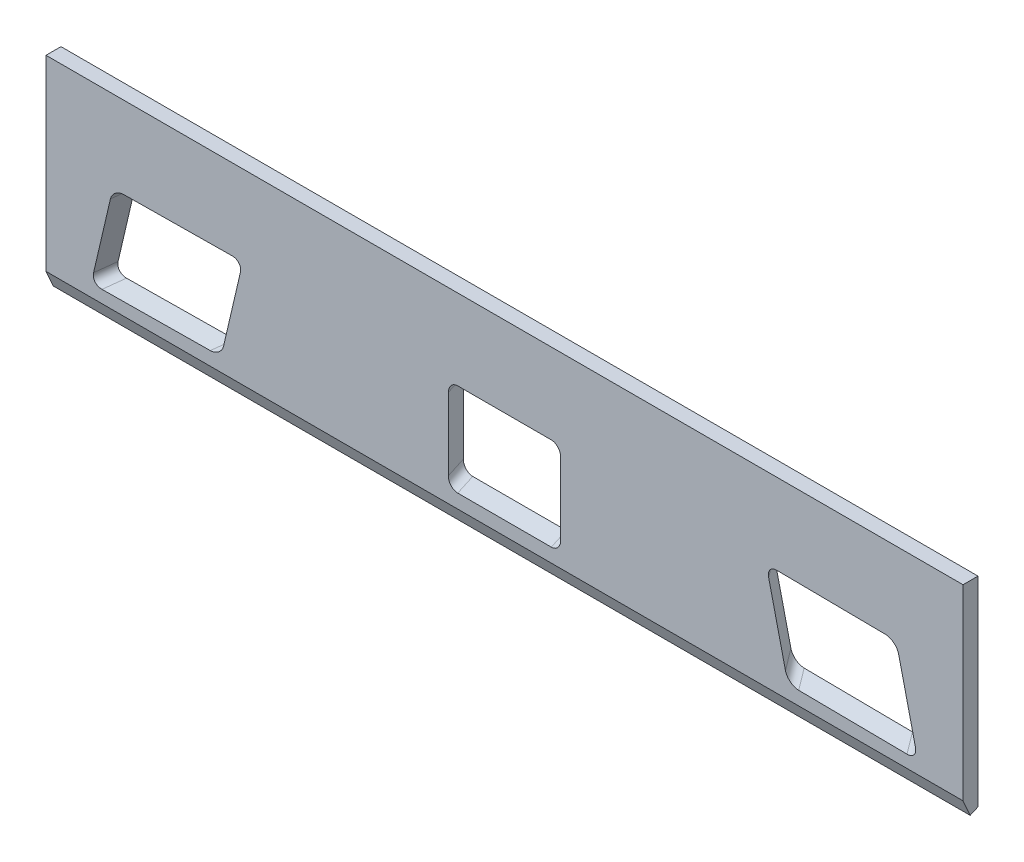
ISO-10303-21;
HEADER;
FILE_DESCRIPTION(('STEP AP214'),'2;1');
FILE_NAME('part.step','',(''),(''),'','','');
FILE_SCHEMA(('AUTOMOTIVE_DESIGN { 1 0 10303 214 1 1 1 1 }'));
ENDSEC;
DATA;
#1=APPLICATION_CONTEXT('core data for automotive mechanical design processes');
#2=APPLICATION_PROTOCOL_DEFINITION('international standard','automotive_design',2000,#1);
#3=PRODUCT_CONTEXT('',#1,'mechanical');
#4=PRODUCT('Part','Part','',(#3));
#5=PRODUCT_RELATED_PRODUCT_CATEGORY('part','',(#4));
#6=PRODUCT_DEFINITION_FORMATION('','',#4);
#7=PRODUCT_DEFINITION_CONTEXT('part definition',#1,'design');
#8=PRODUCT_DEFINITION('design','',#6,#7);
#9=PRODUCT_DEFINITION_SHAPE('','',#8);
#10=(LENGTH_UNIT() NAMED_UNIT(*) SI_UNIT(.MILLI.,.METRE.));
#11=(NAMED_UNIT(*) PLANE_ANGLE_UNIT() SI_UNIT($,.RADIAN.));
#12=(NAMED_UNIT(*) SI_UNIT($,.STERADIAN.) SOLID_ANGLE_UNIT());
#13=UNCERTAINTY_MEASURE_WITH_UNIT(LENGTH_MEASURE(1.E-05),#10,'distance_accuracy_value','');
#14=(GEOMETRIC_REPRESENTATION_CONTEXT(3) GLOBAL_UNCERTAINTY_ASSIGNED_CONTEXT((#13)) GLOBAL_UNIT_ASSIGNED_CONTEXT((#10,
#11,#12)) REPRESENTATION_CONTEXT('',''));
#15=CARTESIAN_POINT('',(0.,0.,0.));
#16=DIRECTION('',(0.,0.,1.));
#17=DIRECTION('',(1.,0.,0.));
#18=AXIS2_PLACEMENT_3D('',#15,#16,#17);
#19=CARTESIAN_POINT('',(0.,0.,0.));
#20=DIRECTION('',(0.,0.,-1.));
#21=DIRECTION('',(-1.,0.,0.));
#22=AXIS2_PLACEMENT_3D('',#19,#20,#21);
#23=PLANE('',#22);
#24=CARTESIAN_POINT('',(-39.9383791054225,0.907278445579991,0.));
#25=DIRECTION('',(0.,0.,1.));
#26=DIRECTION('',(0.80606588725803,0.591825806634795,0.));
#27=AXIS2_PLACEMENT_3D('',#24,#25,#26);
#28=ELLIPSE('',#27,1.27476619092659,1.);
#29=CARTESIAN_POINT('',(-41.0959297575186,0.895047881560696,0.));
#30=VERTEX_POINT('',#29);
#31=CARTESIAN_POINT('',(-39.681116376907,2.01125835078404,0.));
#32=VERTEX_POINT('',#31);
#33=EDGE_CURVE('E293',#30,#32,#28,.F.);
#34=ORIENTED_EDGE('',*,*,#33,.F.);
#35=DIRECTION('',(0.22695135845627,0.97390609449518,0.));
#36=VECTOR('',#35,1.);
#37=CARTESIAN_POINT('',(-39.1770368444935,9.12950620435114,0.));
#38=LINE('',#37,#36);
#39=CARTESIAN_POINT('',(-42.8967688572219,-6.83281145502986,0.));
#40=VERTEX_POINT('',#39);
#41=EDGE_CURVE('E297',#40,#30,#38,.T.);
#42=ORIENTED_EDGE('',*,*,#41,.F.);
#43=CARTESIAN_POINT('',(-41.7392182051258,-6.82058089101056,0.));
#44=DIRECTION('',(0.,0.,1.));
#45=DIRECTION('',(0.80606588725803,0.591825806634795,0.));
#46=AXIS2_PLACEMENT_3D('',#43,#44,#45);
#47=ELLIPSE('',#46,1.27476619092659,0.999999999999996);
#48=CARTESIAN_POINT('',(-41.9964809336437,-7.9245607962384,0.));
#49=VERTEX_POINT('',#48);
#50=EDGE_CURVE('E241',#49,#40,#47,.F.);
#51=ORIENTED_EDGE('',*,*,#50,.F.);
#52=DIRECTION('',(-0.999944185555159,-0.0105653099543036,0.));
#53=VECTOR('',#52,1.);
#54=CARTESIAN_POINT('',(0.0790328782665479,-7.47999513806337,0.));
#55=LINE('',#54,#53);
#56=CARTESIAN_POINT('',(-30.420974412545,-7.80225515546328,0.));
#57=VERTEX_POINT('',#56);
#58=EDGE_CURVE('E52',#57,#49,#55,.T.);
#59=ORIENTED_EDGE('',*,*,#58,.F.);
#60=CARTESIAN_POINT('',(-30.163711684044,-6.69827525026484,0.));
#61=DIRECTION('',(0.,0.,1.));
#62=DIRECTION('',(0.80606588725803,0.591825806634795,0.));
#63=AXIS2_PLACEMENT_3D('',#60,#61,#62);
#64=ELLIPSE('',#63,1.27476619092659,0.999999999999998);
#65=CARTESIAN_POINT('',(-29.0061610319402,-6.6860446862127,0.));
#66=VERTEX_POINT('',#65);
#67=EDGE_CURVE('E262',#66,#57,#64,.F.);
#68=ORIENTED_EDGE('',*,*,#67,.F.);
#69=DIRECTION('',(-0.22695135845627,-0.97390609449518,0.));
#70=VECTOR('',#69,1.);
#71=CARTESIAN_POINT('',(-26.0343311905936,6.06683422929839,0.));
#72=LINE('',#71,#70);
#73=CARTESIAN_POINT('',(-27.2053219320638,1.04181465033428,0.));
#74=VERTEX_POINT('',#73);
#75=EDGE_CURVE('E269',#74,#66,#72,.T.);
#76=ORIENTED_EDGE('',*,*,#75,.F.);
#77=CARTESIAN_POINT('',(-28.3628725843407,1.02958408632571,0.));
#78=DIRECTION('',(0.,0.,1.));
#79=DIRECTION('',(0.80606588725803,0.591825806634795,0.));
#80=AXIS2_PLACEMENT_3D('',#77,#78,#79);
#81=ELLIPSE('',#80,1.27476619092659,1.);
#82=CARTESIAN_POINT('',(-28.1056098558303,2.13356399155348,0.));
#83=VERTEX_POINT('',#82);
#84=EDGE_CURVE('E277',#83,#74,#81,.F.);
#85=ORIENTED_EDGE('',*,*,#84,.F.);
#86=DIRECTION('',(0.999944185555159,0.010565309954304,0.));
#87=VECTOR('',#86,1.);
#88=CARTESIAN_POINT('',(-0.0256778171872214,2.43025373653619,0.));
#89=LINE('',#88,#87);
#90=EDGE_CURVE('E285',#32,#83,#89,.T.);
#91=ORIENTED_EDGE('',*,*,#90,.F.);
#92=EDGE_LOOP('',(#34,#42,#51,#59,#68,#76,#85,#91));
#93=FACE_BOUND('',#92,.T.);
#94=CARTESIAN_POINT('',(41.7392182051258,-6.82058089101056,0.));
#95=DIRECTION('',(0.,0.,-1.));
#96=DIRECTION('',(-0.80606588725803,0.591825806634795,0.));
#97=AXIS2_PLACEMENT_3D('',#94,#95,#96);
#98=ELLIPSE('',#97,1.27476619092659,0.999999999999996);
#99=CARTESIAN_POINT('',(41.9964809336437,-7.9245607962384,0.));
#100=VERTEX_POINT('',#99);
#101=CARTESIAN_POINT('',(42.8967688572219,-6.83281145502986,0.));
#102=VERTEX_POINT('',#101);
#103=EDGE_CURVE('E323',#100,#102,#98,.F.);
#104=ORIENTED_EDGE('',*,*,#103,.T.);
#105=DIRECTION('',(-0.22695135845627,0.97390609449518,0.));
#106=VECTOR('',#105,1.);
#107=CARTESIAN_POINT('',(39.1770368444935,9.12950620435114,0.));
#108=LINE('',#107,#106);
#109=CARTESIAN_POINT('',(41.0959297575186,0.895047881560696,0.));
#110=VERTEX_POINT('',#109);
#111=EDGE_CURVE('E344',#102,#110,#108,.T.);
#112=ORIENTED_EDGE('',*,*,#111,.T.);
#113=CARTESIAN_POINT('',(39.9383791054225,0.907278445579991,0.));
#114=DIRECTION('',(0.,0.,-1.));
#115=DIRECTION('',(-0.80606588725803,0.591825806634795,0.));
#116=AXIS2_PLACEMENT_3D('',#113,#114,#115);
#117=ELLIPSE('',#116,1.27476619092659,1.);
#118=CARTESIAN_POINT('',(39.681116376907,2.01125835078404,0.));
#119=VERTEX_POINT('',#118);
#120=EDGE_CURVE('E341',#110,#119,#117,.F.);
#121=ORIENTED_EDGE('',*,*,#120,.T.);
#122=DIRECTION('',(-0.999944185555159,0.010565309954304,0.));
#123=VECTOR('',#122,1.);
#124=CARTESIAN_POINT('',(0.0256778171872214,2.43025373653619,0.));
#125=LINE('',#124,#123);
#126=CARTESIAN_POINT('',(28.1056098558303,2.13356399155348,0.));
#127=VERTEX_POINT('',#126);
#128=EDGE_CURVE('E338',#119,#127,#125,.T.);
#129=ORIENTED_EDGE('',*,*,#128,.T.);
#130=CARTESIAN_POINT('',(28.3628725843407,1.02958408632571,0.));
#131=DIRECTION('',(0.,0.,-1.));
#132=DIRECTION('',(-0.80606588725803,0.591825806634795,0.));
#133=AXIS2_PLACEMENT_3D('',#130,#131,#132);
#134=ELLIPSE('',#133,1.27476619092659,1.);
#135=CARTESIAN_POINT('',(27.2053219320638,1.04181465033428,0.));
#136=VERTEX_POINT('',#135);
#137=EDGE_CURVE('E335',#127,#136,#134,.F.);
#138=ORIENTED_EDGE('',*,*,#137,.T.);
#139=DIRECTION('',(0.22695135845627,-0.97390609449518,0.));
#140=VECTOR('',#139,1.);
#141=CARTESIAN_POINT('',(26.0343311905936,6.06683422929839,0.));
#142=LINE('',#141,#140);
#143=CARTESIAN_POINT('',(29.0061610319402,-6.6860446862127,0.));
#144=VERTEX_POINT('',#143);
#145=EDGE_CURVE('E332',#136,#144,#142,.T.);
#146=ORIENTED_EDGE('',*,*,#145,.T.);
#147=CARTESIAN_POINT('',(30.163711684044,-6.69827525026484,0.));
#148=DIRECTION('',(0.,0.,-1.));
#149=DIRECTION('',(-0.80606588725803,0.591825806634795,0.));
#150=AXIS2_PLACEMENT_3D('',#147,#148,#149);
#151=ELLIPSE('',#150,1.27476619092659,0.999999999999998);
#152=CARTESIAN_POINT('',(30.420974412545,-7.80225515546328,0.));
#153=VERTEX_POINT('',#152);
#154=EDGE_CURVE('E329',#144,#153,#151,.F.);
#155=ORIENTED_EDGE('',*,*,#154,.T.);
#156=DIRECTION('',(0.999944185555159,-0.0105653099543036,0.));
#157=VECTOR('',#156,1.);
#158=CARTESIAN_POINT('',(-0.0790328782665479,-7.47999513806337,0.));
#159=LINE('',#158,#157);
#160=EDGE_CURVE('E326',#153,#100,#159,.T.);
#161=ORIENTED_EDGE('',*,*,#160,.T.);
#162=EDGE_LOOP('',(#104,#112,#121,#129,#138,#146,#155,#161));
#163=FACE_BOUND('',#162,.T.);
#164=DIRECTION('',(0.,1.,0.));
#165=VECTOR('',#164,1.);
#166=CARTESIAN_POINT('',(49.,-10.,0.));
#167=LINE('',#166,#165);
#168=CARTESIAN_POINT('',(49.,-11.35920512665,0.));
#169=VERTEX_POINT('',#168);
#170=CARTESIAN_POINT('',(49.,10.,0.));
#171=VERTEX_POINT('',#170);
#172=EDGE_CURVE('E408',#169,#171,#167,.T.);
#173=ORIENTED_EDGE('',*,*,#172,.F.);
#174=DIRECTION('',(1.,0.,0.));
#175=VECTOR('',#174,1.);
#176=CARTESIAN_POINT('',(-49.,-11.35920512665,0.));
#177=LINE('',#176,#175);
#178=CARTESIAN_POINT('',(-49.,-11.35920512665,0.));
#179=VERTEX_POINT('',#178);
#180=EDGE_CURVE('E405',#179,#169,#177,.T.);
#181=ORIENTED_EDGE('',*,*,#180,.F.);
#182=DIRECTION('',(0.,-1.,0.));
#183=VECTOR('',#182,1.);
#184=CARTESIAN_POINT('',(-49.,-10.,0.));
#185=LINE('',#184,#183);
#186=CARTESIAN_POINT('',(-49.,10.,0.));
#187=VERTEX_POINT('',#186);
#188=EDGE_CURVE('E414',#187,#179,#185,.T.);
#189=ORIENTED_EDGE('',*,*,#188,.F.);
#190=DIRECTION('',(-1.,0.,0.));
#191=VECTOR('',#190,1.);
#192=CARTESIAN_POINT('',(-49.,10.,0.));
#193=LINE('',#192,#191);
#194=EDGE_CURVE('E423',#171,#187,#193,.T.);
#195=ORIENTED_EDGE('',*,*,#194,.F.);
#196=EDGE_LOOP('',(#173,#181,#189,#195));
#197=FACE_BOUND('',#196,.T.);
#198=CARTESIAN_POINT('',(-5.00000000000051,1.04374388708242,0.));
#199=DIRECTION('',(0.,0.,-1.));
#200=DIRECTION('',(0.,1.,0.));
#201=AXIS2_PLACEMENT_3D('',#198,#199,#200);
#202=ELLIPSE('',#201,1.10252155323938,1.);
#203=CARTESIAN_POINT('',(-5.4744008353113,2.0143034779709,0.));
#204=VERTEX_POINT('',#203);
#205=CARTESIAN_POINT('',(-6.00000000000051,1.04374388708242,0.));
#206=VERTEX_POINT('',#205);
#207=EDGE_CURVE('E434',#204,#206,#202,.F.);
#208=ORIENTED_EDGE('',*,*,#207,.T.);
#209=DIRECTION('',(0.,-1.,0.));
#210=VECTOR('',#209,1.);
#211=CARTESIAN_POINT('',(-6.00000000000051,0.,0.));
#212=LINE('',#211,#210);
#213=CARTESIAN_POINT('',(-6.00000000000051,-6.67390698555187,0.));
#214=VERTEX_POINT('',#213);
#215=EDGE_CURVE('E452',#206,#214,#212,.T.);
#216=ORIENTED_EDGE('',*,*,#215,.T.);
#217=CARTESIAN_POINT('',(-5.00000000000051,-6.67390698555187,0.));
#218=DIRECTION('',(0.,0.,-1.));
#219=DIRECTION('',(0.,1.,0.));
#220=AXIS2_PLACEMENT_3D('',#217,#218,#219);
#221=ELLIPSE('',#220,1.10252155323938,0.999999999999998);
#222=CARTESIAN_POINT('',(-5.00000000000051,-7.77642853866226,0.));
#223=VERTEX_POINT('',#222);
#224=EDGE_CURVE('E449',#214,#223,#221,.F.);
#225=ORIENTED_EDGE('',*,*,#224,.T.);
#226=DIRECTION('',(1.,0.,0.));
#227=VECTOR('',#226,1.);
#228=CARTESIAN_POINT('',(0.,-7.77642853866226,0.));
#229=LINE('',#228,#227);
#230=CARTESIAN_POINT('',(4.99999999999949,-7.77642853879124,0.));
#231=VERTEX_POINT('',#230);
#232=EDGE_CURVE('E446',#223,#231,#229,.T.);
#233=ORIENTED_EDGE('',*,*,#232,.T.);
#234=CARTESIAN_POINT('',(4.99999999999949,-6.67390698555187,0.));
#235=DIRECTION('',(0.,0.,-1.));
#236=DIRECTION('',(0.,1.,0.));
#237=AXIS2_PLACEMENT_3D('',#234,#235,#236);
#238=ELLIPSE('',#237,1.10252155323938,0.999999999999997);
#239=CARTESIAN_POINT('',(5.99999999999948,-6.67390698555187,0.));
#240=VERTEX_POINT('',#239);
#241=EDGE_CURVE('E443',#231,#240,#238,.F.);
#242=ORIENTED_EDGE('',*,*,#241,.T.);
#243=DIRECTION('',(0.,1.,0.));
#244=VECTOR('',#243,1.);
#245=CARTESIAN_POINT('',(5.99999999999949,0.,0.));
#246=LINE('',#245,#244);
#247=CARTESIAN_POINT('',(5.99999999999949,1.04374388713926,0.));
#248=VERTEX_POINT('',#247);
#249=EDGE_CURVE('E440',#240,#248,#246,.T.);
#250=ORIENTED_EDGE('',*,*,#249,.T.);
#251=CARTESIAN_POINT('',(4.99999999999949,1.04374388708242,0.));
#252=DIRECTION('',(0.,0.,-1.));
#253=DIRECTION('',(0.,1.,0.));
#254=AXIS2_PLACEMENT_3D('',#251,#252,#253);
#255=ELLIPSE('',#254,1.10252155323938,1.);
#256=CARTESIAN_POINT('',(5.47440083531028,2.0143034779709,0.));
#257=VERTEX_POINT('',#256);
#258=EDGE_CURVE('E437',#248,#257,#255,.F.);
#259=ORIENTED_EDGE('',*,*,#258,.T.);
#260=DIRECTION('',(-1.,0.,0.));
#261=VECTOR('',#260,1.);
#262=CARTESIAN_POINT('',(0.,2.0143034779709,0.));
#263=LINE('',#262,#261);
#264=EDGE_CURVE('E431',#257,#204,#263,.T.);
#265=ORIENTED_EDGE('',*,*,#264,.T.);
#266=EDGE_LOOP('',(#208,#216,#225,#233,#242,#250,#259,#265));
#267=FACE_BOUND('',#266,.T.);
#268=ADVANCED_FACE('F37',(#93,#163,#197,#267),#23,.T.);
#269=CARTESIAN_POINT('',(49.,-10.,1.6));
#270=DIRECTION('',(-1.,0.,0.));
#271=DIRECTION('',(0.,0.,1.));
#272=AXIS2_PLACEMENT_3D('',#269,#270,#271);
#273=PLANE('',#272);
#274=ORIENTED_EDGE('',*,*,#172,.T.);
#275=DIRECTION('',(0.,0.,-1.));
#276=VECTOR('',#275,1.);
#277=CARTESIAN_POINT('',(49.,10.,1.6));
#278=LINE('',#277,#276);
#279=CARTESIAN_POINT('',(49.,10.,1.6));
#280=VERTEX_POINT('',#279);
#281=EDGE_CURVE('E428',#280,#171,#278,.T.);
#282=ORIENTED_EDGE('',*,*,#281,.F.);
#283=DIRECTION('',(0.,1.,0.));
#284=VECTOR('',#283,1.);
#285=CARTESIAN_POINT('',(49.,-10.,1.6));
#286=LINE('',#285,#284);
#287=CARTESIAN_POINT('',(49.,-10.,1.6));
#288=VERTEX_POINT('',#287);
#289=EDGE_CURVE('E410',#288,#280,#286,.T.);
#290=ORIENTED_EDGE('',*,*,#289,.F.);
#291=DIRECTION('',(0.,-0.914925218522264,-0.403623394406206));
#292=VECTOR('',#291,1.);
#293=CARTESIAN_POINT('',(49.,-11.7286816681054,0.837384270754451));
#294=LINE('',#293,#292);
#295=CARTESIAN_POINT('',(49.,-11.7286816681054,0.837384270754451));
#296=VERTEX_POINT('',#295);
#297=EDGE_CURVE('E392',#288,#296,#294,.T.);
#298=ORIENTED_EDGE('',*,*,#297,.T.);
#299=DIRECTION('',(0.,0.403678896189473,-0.914900731648658));
#300=VECTOR('',#299,1.);
#301=CARTESIAN_POINT('',(49.,-11.35920512665,0.));
#302=LINE('',#301,#300);
#303=EDGE_CURVE('E397',#296,#169,#302,.T.);
#304=ORIENTED_EDGE('',*,*,#303,.T.);
#305=EDGE_LOOP('',(#274,#282,#290,#298,#304));
#306=FACE_BOUND('',#305,.T.);
#307=ADVANCED_FACE('F39',(#306),#273,.F.);
#308=CARTESIAN_POINT('',(-49.,10.,1.6));
#309=DIRECTION('',(0.,-1.,0.));
#310=DIRECTION('',(0.,0.,-1.));
#311=AXIS2_PLACEMENT_3D('',#308,#309,#310);
#312=PLANE('',#311);
#313=ORIENTED_EDGE('',*,*,#194,.T.);
#314=DIRECTION('',(0.,0.,-1.));
#315=VECTOR('',#314,1.);
#316=CARTESIAN_POINT('',(-49.,10.,1.6));
#317=LINE('',#316,#315);
#318=CARTESIAN_POINT('',(-49.,10.,1.6));
#319=VERTEX_POINT('',#318);
#320=EDGE_CURVE('E420',#319,#187,#317,.T.);
#321=ORIENTED_EDGE('',*,*,#320,.F.);
#322=DIRECTION('',(-1.,0.,0.));
#323=VECTOR('',#322,1.);
#324=CARTESIAN_POINT('',(-49.,10.,1.6));
#325=LINE('',#324,#323);
#326=EDGE_CURVE('E413',#280,#319,#325,.T.);
#327=ORIENTED_EDGE('',*,*,#326,.F.);
#328=ORIENTED_EDGE('',*,*,#281,.T.);
#329=EDGE_LOOP('',(#313,#321,#327,#328));
#330=FACE_BOUND('',#329,.T.);
#331=ADVANCED_FACE('F518',(#330),#312,.F.);
#332=CARTESIAN_POINT('',(-49.,-10.,1.6));
#333=DIRECTION('',(1.,0.,0.));
#334=DIRECTION('',(0.,0.,-1.));
#335=AXIS2_PLACEMENT_3D('',#332,#333,#334);
#336=PLANE('',#335);
#337=ORIENTED_EDGE('',*,*,#188,.T.);
#338=DIRECTION('',(0.,0.403678896189473,-0.914900731648658));
#339=VECTOR('',#338,1.);
#340=CARTESIAN_POINT('',(-49.,-11.35920512665,0.));
#341=LINE('',#340,#339);
#342=CARTESIAN_POINT('',(-49.,-11.7286816681054,0.837384270754451));
#343=VERTEX_POINT('',#342);
#344=EDGE_CURVE('E396',#343,#179,#341,.T.);
#345=ORIENTED_EDGE('',*,*,#344,.F.);
#346=DIRECTION('',(0.,-0.914925218522264,-0.403623394406206));
#347=VECTOR('',#346,1.);
#348=CARTESIAN_POINT('',(-49.,-11.7286816681054,0.837384270754451));
#349=LINE('',#348,#347);
#350=CARTESIAN_POINT('',(-49.,-10.,1.6));
#351=VERTEX_POINT('',#350);
#352=EDGE_CURVE('E393',#351,#343,#349,.T.);
#353=ORIENTED_EDGE('',*,*,#352,.F.);
#354=DIRECTION('',(0.,-1.,0.));
#355=VECTOR('',#354,1.);
#356=CARTESIAN_POINT('',(-49.,-10.,1.6));
#357=LINE('',#356,#355);
#358=EDGE_CURVE('E416',#319,#351,#357,.T.);
#359=ORIENTED_EDGE('',*,*,#358,.F.);
#360=ORIENTED_EDGE('',*,*,#320,.T.);
#361=EDGE_LOOP('',(#337,#345,#353,#359,#360));
#362=FACE_BOUND('',#361,.T.);
#363=ADVANCED_FACE('F524',(#362),#336,.F.);
#364=CARTESIAN_POINT('',(0.,0.,1.6));
#365=DIRECTION('',(0.,0.,-1.));
#366=DIRECTION('',(-1.,0.,0.));
#367=AXIS2_PLACEMENT_3D('',#364,#365,#366);
#368=PLANE('',#367);
#369=DIRECTION('',(0.22695135845627,0.97390609449518,0.));
#370=VECTOR('',#369,1.);
#371=CARTESIAN_POINT('',(-39.978676367318,9.31631392608694,1.6));
#372=LINE('',#371,#370);
#373=CARTESIAN_POINT('',(-43.9163940416075,-7.58143573842048,1.6));
#374=VERTEX_POINT('',#373);
#375=CARTESIAN_POINT('',(-42.1155549419042,0.14642359817008,1.6));
#376=VERTEX_POINT('',#375);
#377=EDGE_CURVE('E60',#374,#376,#372,.T.);
#378=ORIENTED_EDGE('',*,*,#377,.T.);
#379=CARTESIAN_POINT('',(-40.9580042898081,0.158654162189376,1.6));
#380=DIRECTION('',(0.,0.,1.));
#381=DIRECTION('',(0.80606588725803,0.591825806634795,0.));
#382=AXIS2_PLACEMENT_3D('',#379,#380,#381);
#383=ELLIPSE('',#382,1.27476619092659,1.);
#384=CARTESIAN_POINT('',(-40.7007415612926,1.26263406739342,1.6));
#385=VERTEX_POINT('',#384);
#386=EDGE_CURVE('E290',#376,#385,#383,.F.);
#387=ORIENTED_EDGE('',*,*,#386,.T.);
#388=DIRECTION('',(0.999944185555159,0.010565309954304,0.));
#389=VECTOR('',#388,1.);
#390=CARTESIAN_POINT('',(-0.0178826275061431,1.69248507375139,1.6));
#391=LINE('',#390,#389);
#392=CARTESIAN_POINT('',(-29.1252350402159,1.38493970816286,1.6));
#393=VERTEX_POINT('',#392);
#394=EDGE_CURVE('E282',#385,#393,#391,.T.);
#395=ORIENTED_EDGE('',*,*,#394,.T.);
#396=CARTESIAN_POINT('',(-29.3824977687263,0.280959802935096,1.6));
#397=DIRECTION('',(0.,0.,1.));
#398=DIRECTION('',(0.80606588725803,0.591825806634795,0.));
#399=AXIS2_PLACEMENT_3D('',#396,#397,#398);
#400=ELLIPSE('',#399,1.27476619092659,1.);
#401=CARTESIAN_POINT('',(-28.2249471164494,0.293190366943665,1.6));
#402=VERTEX_POINT('',#401);
#403=EDGE_CURVE('E274',#393,#402,#400,.F.);
#404=ORIENTED_EDGE('',*,*,#403,.T.);
#405=DIRECTION('',(-0.22695135845627,-0.97390609449518,0.));
#406=VECTOR('',#405,1.);
#407=CARTESIAN_POINT('',(-26.8359707134181,6.25364195103419,1.6));
#408=LINE('',#407,#406);
#409=CARTESIAN_POINT('',(-30.0257862163258,-7.43466896960332,1.6));
#410=VERTEX_POINT('',#409);
#411=EDGE_CURVE('E267',#402,#410,#408,.T.);
#412=ORIENTED_EDGE('',*,*,#411,.T.);
#413=CARTESIAN_POINT('',(-31.1833368684296,-7.44689953365545,1.6));
#414=DIRECTION('',(0.,0.,1.));
#415=DIRECTION('',(0.80606588725803,0.591825806634795,0.));
#416=AXIS2_PLACEMENT_3D('',#413,#414,#415);
#417=ELLIPSE('',#416,1.27476619092659,0.999999999999998);
#418=CARTESIAN_POINT('',(-31.4405995969306,-8.5508794388539,1.6));
#419=VERTEX_POINT('',#418);
#420=EDGE_CURVE('E252',#410,#419,#417,.F.);
#421=ORIENTED_EDGE('',*,*,#420,.T.);
#422=DIRECTION('',(-0.999944185555159,-0.0105653099543036,0.));
#423=VECTOR('',#422,1.);
#424=CARTESIAN_POINT('',(0.0868280679476258,-8.21776380084816,1.6));
#425=LINE('',#424,#423);
#426=CARTESIAN_POINT('',(-43.0161061180292,-8.67318507962901,1.6));
#427=VERTEX_POINT('',#426);
#428=EDGE_CURVE('E235',#419,#427,#425,.T.);
#429=ORIENTED_EDGE('',*,*,#428,.T.);
#430=CARTESIAN_POINT('',(-42.7588433895114,-7.56920517440117,1.6));
#431=DIRECTION('',(0.,0.,1.));
#432=DIRECTION('',(0.80606588725803,0.591825806634795,0.));
#433=AXIS2_PLACEMENT_3D('',#430,#431,#432);
#434=ELLIPSE('',#433,1.27476619092659,0.999999999999996);
#435=EDGE_CURVE('E244',#427,#374,#434,.F.);
#436=ORIENTED_EDGE('',*,*,#435,.T.);
#437=EDGE_LOOP('',(#378,#387,#395,#404,#412,#421,#429,#436));
#438=FACE_BOUND('',#437,.T.);
#439=DIRECTION('',(-0.22695135845627,0.97390609449518,0.));
#440=VECTOR('',#439,1.);
#441=CARTESIAN_POINT('',(39.978676367318,9.31631392608694,1.6));
#442=LINE('',#441,#440);
#443=CARTESIAN_POINT('',(43.9163940416075,-7.58143573842048,1.6));
#444=VERTEX_POINT('',#443);
#445=CARTESIAN_POINT('',(42.1155549419042,0.14642359817008,1.6));
#446=VERTEX_POINT('',#445);
#447=EDGE_CURVE('E11',#444,#446,#442,.T.);
#448=ORIENTED_EDGE('',*,*,#447,.F.);
#449=CARTESIAN_POINT('',(42.7588433895114,-7.56920517440117,1.6));
#450=DIRECTION('',(0.,0.,-1.));
#451=DIRECTION('',(-0.80606588725803,0.591825806634795,0.));
#452=AXIS2_PLACEMENT_3D('',#449,#450,#451);
#453=ELLIPSE('',#452,1.27476619092659,0.999999999999996);
#454=CARTESIAN_POINT('',(43.0161061180292,-8.67318507962901,1.6));
#455=VERTEX_POINT('',#454);
#456=EDGE_CURVE('E457',#455,#444,#453,.F.);
#457=ORIENTED_EDGE('',*,*,#456,.F.);
#458=DIRECTION('',(0.999944185555159,-0.0105653099543036,0.));
#459=VECTOR('',#458,1.);
#460=CARTESIAN_POINT('',(-0.0868280679476258,-8.21776380084816,1.6));
#461=LINE('',#460,#459);
#462=CARTESIAN_POINT('',(31.4405995969306,-8.5508794388539,1.6));
#463=VERTEX_POINT('',#462);
#464=EDGE_CURVE('E459',#463,#455,#461,.T.);
#465=ORIENTED_EDGE('',*,*,#464,.F.);
#466=CARTESIAN_POINT('',(31.1833368684296,-7.44689953365545,1.6));
#467=DIRECTION('',(0.,0.,-1.));
#468=DIRECTION('',(-0.80606588725803,0.591825806634795,0.));
#469=AXIS2_PLACEMENT_3D('',#466,#467,#468);
#470=ELLIPSE('',#469,1.27476619092659,0.999999999999998);
#471=CARTESIAN_POINT('',(30.0257862163258,-7.43466896960332,1.6));
#472=VERTEX_POINT('',#471);
#473=EDGE_CURVE('E462',#472,#463,#470,.F.);
#474=ORIENTED_EDGE('',*,*,#473,.F.);
#475=DIRECTION('',(0.22695135845627,-0.97390609449518,0.));
#476=VECTOR('',#475,1.);
#477=CARTESIAN_POINT('',(26.8359707134181,6.25364195103419,1.6));
#478=LINE('',#477,#476);
#479=CARTESIAN_POINT('',(28.2249471164494,0.293190366943665,1.6));
#480=VERTEX_POINT('',#479);
#481=EDGE_CURVE('E464',#480,#472,#478,.T.);
#482=ORIENTED_EDGE('',*,*,#481,.F.);
#483=CARTESIAN_POINT('',(29.3824977687263,0.280959802935096,1.6));
#484=DIRECTION('',(0.,0.,-1.));
#485=DIRECTION('',(-0.80606588725803,0.591825806634795,0.));
#486=AXIS2_PLACEMENT_3D('',#483,#484,#485);
#487=ELLIPSE('',#486,1.27476619092659,1.);
#488=CARTESIAN_POINT('',(29.1252350402159,1.38493970816286,1.6));
#489=VERTEX_POINT('',#488);
#490=EDGE_CURVE('E466',#489,#480,#487,.F.);
#491=ORIENTED_EDGE('',*,*,#490,.F.);
#492=DIRECTION('',(-0.999944185555159,0.010565309954304,0.));
#493=VECTOR('',#492,1.);
#494=CARTESIAN_POINT('',(0.0178826275061431,1.69248507375139,1.6));
#495=LINE('',#494,#493);
#496=CARTESIAN_POINT('',(40.7007415612926,1.26263406739342,1.6));
#497=VERTEX_POINT('',#496);
#498=EDGE_CURVE('E468',#497,#489,#495,.T.);
#499=ORIENTED_EDGE('',*,*,#498,.F.);
#500=CARTESIAN_POINT('',(40.9580042898081,0.158654162189376,1.6));
#501=DIRECTION('',(0.,0.,-1.));
#502=DIRECTION('',(-0.80606588725803,0.591825806634795,0.));
#503=AXIS2_PLACEMENT_3D('',#500,#501,#502);
#504=ELLIPSE('',#503,1.27476619092659,1.);
#505=EDGE_CURVE('E45',#446,#497,#504,.F.);
#506=ORIENTED_EDGE('',*,*,#505,.F.);
#507=EDGE_LOOP('',(#448,#457,#465,#474,#482,#491,#499,#506));
#508=FACE_BOUND('',#507,.T.);
#509=DIRECTION('',(0.,1.,0.));
#510=VECTOR('',#509,1.);
#511=CARTESIAN_POINT('',(5.99999999999949,0.,1.6));
#512=LINE('',#511,#510);
#513=CARTESIAN_POINT('',(5.99999999999948,-7.41675129286995,1.6));
#514=VERTEX_POINT('',#513);
#515=CARTESIAN_POINT('',(5.99999999999949,0.300899579821178,1.6));
#516=VERTEX_POINT('',#515);
#517=EDGE_CURVE('E390',#514,#516,#512,.T.);
#518=ORIENTED_EDGE('',*,*,#517,.F.);
#519=CARTESIAN_POINT('',(4.99999999999949,-7.41675129286995,1.6));
#520=DIRECTION('',(0.,0.,-1.));
#521=DIRECTION('',(0.,1.,0.));
#522=AXIS2_PLACEMENT_3D('',#519,#520,#521);
#523=ELLIPSE('',#522,1.10252155323938,0.999999999999997);
#524=CARTESIAN_POINT('',(4.99999999999949,-8.51927284610932,1.6));
#525=VERTEX_POINT('',#524);
#526=EDGE_CURVE('E377',#525,#514,#523,.F.);
#527=ORIENTED_EDGE('',*,*,#526,.F.);
#528=DIRECTION('',(1.,0.,0.));
#529=VECTOR('',#528,1.);
#530=CARTESIAN_POINT('',(0.,-8.51927284598033,1.6));
#531=LINE('',#530,#529);
#532=CARTESIAN_POINT('',(-5.00000000000051,-8.51927284598034,1.6));
#533=VERTEX_POINT('',#532);
#534=EDGE_CURVE('E379',#533,#525,#531,.T.);
#535=ORIENTED_EDGE('',*,*,#534,.F.);
#536=CARTESIAN_POINT('',(-5.00000000000051,-7.41675129286995,1.6));
#537=DIRECTION('',(0.,0.,-1.));
#538=DIRECTION('',(0.,1.,0.));
#539=AXIS2_PLACEMENT_3D('',#536,#537,#538);
#540=ELLIPSE('',#539,1.10252155323938,0.999999999999998);
#541=CARTESIAN_POINT('',(-6.00000000000051,-7.41675129286995,1.6));
#542=VERTEX_POINT('',#541);
#543=EDGE_CURVE('E382',#542,#533,#540,.F.);
#544=ORIENTED_EDGE('',*,*,#543,.F.);
#545=DIRECTION('',(0.,-1.,0.));
#546=VECTOR('',#545,1.);
#547=CARTESIAN_POINT('',(-6.00000000000051,0.,1.6));
#548=LINE('',#547,#546);
#549=CARTESIAN_POINT('',(-6.00000000000051,0.300899579764338,1.6));
#550=VERTEX_POINT('',#549);
#551=EDGE_CURVE('E384',#550,#542,#548,.T.);
#552=ORIENTED_EDGE('',*,*,#551,.F.);
#553=CARTESIAN_POINT('',(-5.00000000000051,0.300899579764338,1.6));
#554=DIRECTION('',(0.,0.,-1.));
#555=DIRECTION('',(0.,1.,0.));
#556=AXIS2_PLACEMENT_3D('',#553,#554,#555);
#557=ELLIPSE('',#556,1.10252155323938,1.);
#558=CARTESIAN_POINT('',(-5.00000000003773,1.40342113300372,1.6));
#559=VERTEX_POINT('',#558);
#560=EDGE_CURVE('E386',#559,#550,#557,.F.);
#561=ORIENTED_EDGE('',*,*,#560,.F.);
#562=DIRECTION('',(-1.,0.,0.));
#563=VECTOR('',#562,1.);
#564=CARTESIAN_POINT('',(0.,1.40342113312745,1.6));
#565=LINE('',#564,#563);
#566=CARTESIAN_POINT('',(4.99999999999949,1.40342113312745,1.6));
#567=VERTEX_POINT('',#566);
#568=EDGE_CURVE('E455',#567,#559,#565,.T.);
#569=ORIENTED_EDGE('',*,*,#568,.F.);
#570=CARTESIAN_POINT('',(4.99999999999949,0.300899579764338,1.6));
#571=DIRECTION('',(0.,0.,-1.));
#572=DIRECTION('',(0.,1.,0.));
#573=AXIS2_PLACEMENT_3D('',#570,#571,#572);
#574=ELLIPSE('',#573,1.10252155323938,1.);
#575=EDGE_CURVE('E388',#516,#567,#574,.F.);
#576=ORIENTED_EDGE('',*,*,#575,.F.);
#577=EDGE_LOOP('',(#518,#527,#535,#544,#552,#561,#569,#576));
#578=FACE_BOUND('',#577,.T.);
#579=ORIENTED_EDGE('',*,*,#289,.T.);
#580=ORIENTED_EDGE('',*,*,#326,.T.);
#581=ORIENTED_EDGE('',*,*,#358,.T.);
#582=DIRECTION('',(1.,0.,0.));
#583=VECTOR('',#582,1.);
#584=CARTESIAN_POINT('',(-49.,-10.,1.6));
#585=LINE('',#584,#583);
#586=EDGE_CURVE('E418',#351,#288,#585,.T.);
#587=ORIENTED_EDGE('',*,*,#586,.T.);
#588=EDGE_LOOP('',(#579,#580,#581,#587));
#589=FACE_BOUND('',#588,.T.);
#590=ADVANCED_FACE('F248',(#438,#508,#578,#589),#368,.F.);
#591=CARTESIAN_POINT('',(-49.,-11.35920512665,0.));
#592=DIRECTION('',(0.,-0.914900731648658,-0.403678896189473));
#593=DIRECTION('',(0.,0.403678896189473,-0.914900731648658));
#594=AXIS2_PLACEMENT_3D('',#591,#592,#593);
#595=PLANE('',#594);
#596=ORIENTED_EDGE('',*,*,#303,.F.);
#597=DIRECTION('',(1.,0.,0.));
#598=VECTOR('',#597,1.);
#599=CARTESIAN_POINT('',(-49.,-11.7286816681054,0.837384270754451));
#600=LINE('',#599,#598);
#601=EDGE_CURVE('E400',#343,#296,#600,.T.);
#602=ORIENTED_EDGE('',*,*,#601,.F.);
#603=ORIENTED_EDGE('',*,*,#344,.T.);
#604=ORIENTED_EDGE('',*,*,#180,.T.);
#605=EDGE_LOOP('',(#596,#602,#603,#604));
#606=FACE_BOUND('',#605,.T.);
#607=ADVANCED_FACE('F541',(#606),#595,.T.);
#608=CARTESIAN_POINT('',(-49.,-11.7286816681054,0.837384270754451));
#609=DIRECTION('',(0.,-0.403623394406206,0.914925218522264));
#610=DIRECTION('',(0.,-0.914925218522264,-0.403623394406206));
#611=AXIS2_PLACEMENT_3D('',#608,#609,#610);
#612=PLANE('',#611);
#613=ORIENTED_EDGE('',*,*,#297,.F.);
#614=ORIENTED_EDGE('',*,*,#586,.F.);
#615=ORIENTED_EDGE('',*,*,#352,.T.);
#616=ORIENTED_EDGE('',*,*,#601,.T.);
#617=EDGE_LOOP('',(#613,#614,#615,#616));
#618=FACE_BOUND('',#617,.T.);
#619=ADVANCED_FACE('F545',(#618),#612,.T.);
#620=CARTESIAN_POINT('',(-5.00000000000052,-6.29924174428707,18.190637476052));
#621=DIRECTION('',(0.,-0.907011746901315,-0.421105320535167));
#622=DIRECTION('',(0.,0.421105320535167,-0.907011746901315));
#623=AXIS2_PLACEMENT_3D('',#620,#621,#622);
#624=PLANE('',#623);
#625=ORIENTED_EDGE('',*,*,#568,.T.);
#626=DIRECTION('',(0.,0.421105320535167,-0.907011746901315));
#627=VECTOR('',#626,1.);
#628=CARTESIAN_POINT('',(-5.00000000003774,-6.29924174438673,18.1906374760002));
#629=LINE('',#628,#627);
#630=CARTESIAN_POINT('',(-5.00000000003773,2.1228646663166,0.0504025379739282));
#631=VERTEX_POINT('',#630);
#632=EDGE_CURVE('E370',#559,#631,#629,.T.);
#633=ORIENTED_EDGE('',*,*,#632,.T.);
#634=DIRECTION('',(-1.,0.,0.));
#635=VECTOR('',#634,1.);
#636=CARTESIAN_POINT('',(-5.00000000000052,2.12286466641626,0.0504025380257587));
#637=LINE('',#636,#635);
#638=CARTESIAN_POINT('',(4.99999999999949,2.12286466641627,0.0504025380257606));
#639=VERTEX_POINT('',#638);
#640=EDGE_CURVE('E350',#639,#631,#637,.T.);
#641=ORIENTED_EDGE('',*,*,#640,.F.);
#642=DIRECTION('',(0.,0.421105320535167,-0.907011746901315));
#643=VECTOR('',#642,1.);
#644=CARTESIAN_POINT('',(4.99999999999949,-6.29924174428707,18.1906374760521));
#645=LINE('',#644,#643);
#646=EDGE_CURVE('E372',#567,#639,#645,.T.);
#647=ORIENTED_EDGE('',*,*,#646,.F.);
#648=EDGE_LOOP('',(#625,#633,#641,#647));
#649=FACE_BOUND('',#648,.T.);
#650=ADVANCED_FACE('F556',(#649),#624,.T.);
#651=CARTESIAN_POINT('',(5.99999999999948,-13.5553357195322,14.8217949117546));
#652=DIRECTION('',(-1.,0.,0.));
#653=DIRECTION('',(0.,-1.,0.));
#654=AXIS2_PLACEMENT_3D('',#651,#652,#653);
#655=PLANE('',#654);
#656=ORIENTED_EDGE('',*,*,#517,.T.);
#657=DIRECTION('',(0.,0.421105320535167,-0.907011746901315));
#658=VECTOR('',#657,1.);
#659=CARTESIAN_POINT('',(5.99999999999949,-7.20625349124129,17.7695321554868));
#660=LINE('',#659,#658);
#661=EDGE_CURVE('E374',#516,#248,#660,.T.);
#662=ORIENTED_EDGE('',*,*,#661,.T.);
#663=ORIENTED_EDGE('',*,*,#249,.F.);
#664=DIRECTION('',(0.,0.421105320535167,-0.907011746901315));
#665=VECTOR('',#664,1.);
#666=CARTESIAN_POINT('',(5.99999999999948,-13.5553357195568,14.821794911721));
#667=LINE('',#666,#665);
#668=EDGE_CURVE('E355',#514,#240,#667,.T.);
#669=ORIENTED_EDGE('',*,*,#668,.F.);
#670=EDGE_LOOP('',(#656,#662,#663,#669));
#671=FACE_BOUND('',#670,.T.);
#672=ADVANCED_FACE('F558',(#671),#655,.T.);
#673=CARTESIAN_POINT('',(4.99999999999949,-7.20625349128805,17.7695321554651));
#674=DIRECTION('',(0.,0.421105320535167,-0.907011746901315));
#675=DIRECTION('',(0.,0.907011746901315,0.421105320535167));
#676=AXIS2_PLACEMENT_3D('',#673,#674,#675);
#677=CYLINDRICAL_SURFACE('',#676,1.);
#678=ORIENTED_EDGE('',*,*,#575,.T.);
#679=ORIENTED_EDGE('',*,*,#646,.T.);
#680=CARTESIAN_POINT('',(4.99999999999949,1.21585291941528,-0.370702782561239));
#681=DIRECTION('',(0.,-0.421105320535167,0.907011746901315));
#682=DIRECTION('',(0.,-0.907011746901315,-0.421105320535167));
#683=AXIS2_PLACEMENT_3D('',#680,#681,#682);
#684=CIRCLE('',#683,1.);
#685=EDGE_CURVE('E347',#257,#639,#684,.T.);
#686=ORIENTED_EDGE('',*,*,#685,.F.);
#687=ORIENTED_EDGE('',*,*,#258,.F.);
#688=ORIENTED_EDGE('',*,*,#661,.F.);
#689=EDGE_LOOP('',(#678,#679,#686,#687,#688));
#690=FACE_BOUND('',#689,.T.);
#691=ADVANCED_FACE('F561',(#690),#677,.F.);
#692=CARTESIAN_POINT('',(-5.00000000000051,-7.20625349128805,17.7695321554651));
#693=DIRECTION('',(0.,0.421105320535167,-0.907011746901315));
#694=DIRECTION('',(0.,0.907011746901315,0.421105320535167));
#695=AXIS2_PLACEMENT_3D('',#692,#693,#694);
#696=CYLINDRICAL_SURFACE('',#695,1.);
#697=ORIENTED_EDGE('',*,*,#560,.T.);
#698=DIRECTION('',(0.,0.421105320535167,-0.907011746901315));
#699=VECTOR('',#698,1.);
#700=CARTESIAN_POINT('',(-6.00000000000052,-7.20625349129017,17.7695321554696));
#701=LINE('',#700,#699);
#702=EDGE_CURVE('E367',#550,#206,#701,.T.);
#703=ORIENTED_EDGE('',*,*,#702,.T.);
#704=ORIENTED_EDGE('',*,*,#207,.F.);
#705=CARTESIAN_POINT('',(-5.00000000000051,1.21585291941528,-0.370702782561239));
#706=DIRECTION('',(0.,-0.421105320535167,0.907011746901315));
#707=DIRECTION('',(0.,-0.907011746901315,-0.421105320535167));
#708=AXIS2_PLACEMENT_3D('',#705,#706,#707);
#709=CIRCLE('',#708,1.);
#710=EDGE_CURVE('E353',#631,#204,#709,.T.);
#711=ORIENTED_EDGE('',*,*,#710,.F.);
#712=ORIENTED_EDGE('',*,*,#632,.F.);
#713=EDGE_LOOP('',(#697,#703,#704,#711,#712));
#714=FACE_BOUND('',#713,.T.);
#715=ADVANCED_FACE('F565',(#714),#696,.F.);
#716=CARTESIAN_POINT('',(-6.00000000000051,-13.5553357195322,14.8217949117546));
#717=DIRECTION('',(1.,0.,0.));
#718=DIRECTION('',(0.,1.,0.));
#719=AXIS2_PLACEMENT_3D('',#716,#717,#718);
#720=PLANE('',#719);
#721=ORIENTED_EDGE('',*,*,#551,.T.);
#722=DIRECTION('',(0.,0.421105320535167,-0.907011746901315));
#723=VECTOR('',#722,1.);
#724=CARTESIAN_POINT('',(-6.00000000000051,-13.5553357195568,14.821794911721));
#725=LINE('',#724,#723);
#726=EDGE_CURVE('E364',#542,#214,#725,.T.);
#727=ORIENTED_EDGE('',*,*,#726,.T.);
#728=ORIENTED_EDGE('',*,*,#215,.F.);
#729=ORIENTED_EDGE('',*,*,#702,.F.);
#730=EDGE_LOOP('',(#721,#727,#728,#729));
#731=FACE_BOUND('',#730,.T.);
#732=ADVANCED_FACE('F572',(#731),#720,.T.);
#733=CARTESIAN_POINT('',(-5.00000000000052,-13.5553357195568,14.821794911721));
#734=DIRECTION('',(0.,0.421105320535167,-0.907011746901315));
#735=DIRECTION('',(0.,0.907011746901315,0.421105320535167));
#736=AXIS2_PLACEMENT_3D('',#733,#734,#735);
#737=CYLINDRICAL_SURFACE('',#736,0.999999999999998);
#738=ORIENTED_EDGE('',*,*,#543,.T.);
#739=DIRECTION('',(0.,0.421105320535167,-0.907011746901315));
#740=VECTOR('',#739,1.);
#741=CARTESIAN_POINT('',(-5.00000000000052,-14.4623474663605,14.4006895912534));
#742=LINE('',#741,#740);
#743=EDGE_CURVE('E361',#533,#223,#742,.T.);
#744=ORIENTED_EDGE('',*,*,#743,.T.);
#745=ORIENTED_EDGE('',*,*,#224,.F.);
#746=ORIENTED_EDGE('',*,*,#726,.F.);
#747=EDGE_LOOP('',(#738,#744,#745,#746));
#748=FACE_BOUND('',#747,.T.);
#749=ADVANCED_FACE('F576',(#748),#737,.F.);
#750=CARTESIAN_POINT('',(-5.00000000000052,-14.4623474663605,14.4006895912534));
#751=DIRECTION('',(0.,0.907011746901315,0.421105320535167));
#752=DIRECTION('',(0.,-0.421105320535167,0.907011746901315));
#753=AXIS2_PLACEMENT_3D('',#750,#751,#752);
#754=PLANE('',#753);
#755=ORIENTED_EDGE('',*,*,#534,.T.);
#756=DIRECTION('',(0.,0.421105320535167,-0.907011746901315));
#757=VECTOR('',#756,1.);
#758=CARTESIAN_POINT('',(4.99999999999949,-14.4623474664582,14.4006895911858));
#759=LINE('',#758,#757);
#760=EDGE_CURVE('E358',#525,#231,#759,.T.);
#761=ORIENTED_EDGE('',*,*,#760,.T.);
#762=ORIENTED_EDGE('',*,*,#232,.F.);
#763=ORIENTED_EDGE('',*,*,#743,.F.);
#764=EDGE_LOOP('',(#755,#761,#762,#763));
#765=FACE_BOUND('',#764,.T.);
#766=ADVANCED_FACE('F580',(#765),#754,.T.);
#767=CARTESIAN_POINT('',(4.99999999999949,-13.5553357195568,14.821794911721));
#768=DIRECTION('',(0.,0.421105320535167,-0.907011746901315));
#769=DIRECTION('',(0.,0.907011746901315,0.421105320535167));
#770=AXIS2_PLACEMENT_3D('',#767,#768,#769);
#771=CYLINDRICAL_SURFACE('',#770,0.999999999999997);
#772=ORIENTED_EDGE('',*,*,#526,.T.);
#773=ORIENTED_EDGE('',*,*,#668,.T.);
#774=ORIENTED_EDGE('',*,*,#241,.F.);
#775=ORIENTED_EDGE('',*,*,#760,.F.);
#776=EDGE_LOOP('',(#772,#773,#774,#775));
#777=FACE_BOUND('',#776,.T.);
#778=ADVANCED_FACE('F584',(#777),#771,.F.);
#779=CARTESIAN_POINT('',(4.99999999999949,1.21585291941528,-0.370702782561239));
#780=DIRECTION('',(0.,-0.421105320535167,0.907011746901315));
#781=DIRECTION('',(0.,-0.907011746901315,-0.421105320535167));
#782=AXIS2_PLACEMENT_3D('',#779,#780,#781);
#783=PLANE('',#782);
#784=ORIENTED_EDGE('',*,*,#685,.T.);
#785=ORIENTED_EDGE('',*,*,#640,.T.);
#786=ORIENTED_EDGE('',*,*,#710,.T.);
#787=ORIENTED_EDGE('',*,*,#264,.F.);
#788=EDGE_LOOP('',(#784,#785,#786,#787));
#789=FACE_BOUND('',#788,.T.);
#790=ADVANCED_FACE('F588',(#789),#783,.T.);
#791=CARTESIAN_POINT('',(47.2783238865925,-10.0498156487428,6.87555403164003));
#792=DIRECTION('',(-0.866025403784438,-0.201811697203103,0.457462609261132));
#793=DIRECTION('',(0.467072943073694,0.,0.884218788450279));
#794=AXIS2_PLACEMENT_3D('',#791,#792,#793);
#795=PLANE('',#794);
#796=DIRECTION('',(-0.499907939806432,0.367039995608166,-0.784457579058579));
#797=VECTOR('',#796,1.);
#798=CARTESIAN_POINT('',(47.2783238866829,-10.049815648628,6.87555403151594));
#799=LINE('',#798,#797);
#800=EDGE_CURVE('E300',#444,#102,#799,.T.);
#801=ORIENTED_EDGE('',*,*,#800,.F.);
#802=ORIENTED_EDGE('',*,*,#447,.T.);
#803=DIRECTION('',(-0.499907939806432,0.367039995608166,-0.784457579058579));
#804=VECTOR('',#803,1.);
#805=CARTESIAN_POINT('',(47.3454843974357,-3.69346997329941,9.80682664276531));
#806=LINE('',#805,#804);
#807=EDGE_CURVE('E320',#446,#110,#806,.T.);
#808=ORIENTED_EDGE('',*,*,#807,.T.);
#809=ORIENTED_EDGE('',*,*,#111,.F.);
#810=EDGE_LOOP('',(#801,#802,#808,#809));
#811=FACE_BOUND('',#810,.T.);
#812=ADVANCED_FACE('F494',(#811),#795,.T.);
#813=CARTESIAN_POINT('',(46.4794589936508,-3.89528167054379,10.2642892520074));
#814=DIRECTION('',(-0.499907939806432,0.367039995608166,-0.784457579058579));
#815=DIRECTION('',(-0.843316734753661,0.,0.537416863230419));
#816=AXIS2_PLACEMENT_3D('',#813,#814,#815);
#817=CYLINDRICAL_SURFACE('',#816,1.);
#818=ORIENTED_EDGE('',*,*,#807,.F.);
#819=ORIENTED_EDGE('',*,*,#505,.T.);
#820=DIRECTION('',(-0.499907939806432,0.367039995608166,-0.784457579058579));
#821=VECTOR('',#820,1.);
#822=CARTESIAN_POINT('',(46.4890533523876,-2.98723228840969,10.6830424822554));
#823=LINE('',#822,#821);
#824=EDGE_CURVE('E317',#497,#119,#823,.T.);
#825=ORIENTED_EDGE('',*,*,#824,.T.);
#826=ORIENTED_EDGE('',*,*,#120,.F.);
#827=EDGE_LOOP('',(#818,#819,#825,#826));
#828=FACE_BOUND('',#827,.T.);
#829=ADVANCED_FACE('F473',(#828),#817,.F.);
#830=CARTESIAN_POINT('',(37.8287993144847,-5.00534926045436,15.2576685748976));
#831=DIRECTION('',(-0.00959435868045685,-0.908049382190176,-0.418753230179243));
#832=DIRECTION('',(0.,0.418772504987193,-0.908091178828839));
#833=AXIS2_PLACEMENT_3D('',#830,#831,#832);
#834=PLANE('',#833);
#835=ORIENTED_EDGE('',*,*,#824,.F.);
#836=ORIENTED_EDGE('',*,*,#498,.T.);
#837=DIRECTION('',(-0.499907939806432,0.367039995608166,-0.784457579058579));
#838=VECTOR('',#837,1.);
#839=CARTESIAN_POINT('',(37.8287993145378,-5.0053492603609,15.2576685748559));
#840=LINE('',#839,#838);
#841=EDGE_CURVE('E314',#489,#127,#840,.T.);
#842=ORIENTED_EDGE('',*,*,#841,.T.);
#843=ORIENTED_EDGE('',*,*,#128,.F.);
#844=EDGE_LOOP('',(#835,#836,#842,#843));
#845=FACE_BOUND('',#844,.T.);
#846=ADVANCED_FACE('F477',(#845),#834,.T.);
#847=CARTESIAN_POINT('',(37.8192049558441,-5.91339864255416,14.8389153446836));
#848=DIRECTION('',(-0.499907939806432,0.367039995608166,-0.784457579058579));
#849=DIRECTION('',(-0.843316734753661,0.,0.537416863230419));
#850=AXIS2_PLACEMENT_3D('',#847,#848,#849);
#851=CYLINDRICAL_SURFACE('',#850,1.);
#852=ORIENTED_EDGE('',*,*,#841,.F.);
#853=ORIENTED_EDGE('',*,*,#490,.T.);
#854=DIRECTION('',(-0.499907939806432,0.367039995608166,-0.784457579058579));
#855=VECTOR('',#854,1.);
#856=CARTESIAN_POINT('',(36.9531795519419,-6.11521033985585,15.2963779540253));
#857=LINE('',#856,#855);
#858=EDGE_CURVE('E311',#480,#136,#857,.T.);
#859=ORIENTED_EDGE('',*,*,#858,.T.);
#860=ORIENTED_EDGE('',*,*,#137,.F.);
#861=EDGE_LOOP('',(#852,#853,#859,#860));
#862=FACE_BOUND('',#861,.T.);
#863=ADVANCED_FACE('F485',(#862),#851,.F.);
#864=CARTESIAN_POINT('',(36.8860190411788,-12.4715560151801,12.3651053427738));
#865=DIRECTION('',(0.866025403784438,0.201811697203104,-0.457462609261132));
#866=DIRECTION('',(-0.467072943073693,0.,-0.884218788450279));
#867=AXIS2_PLACEMENT_3D('',#864,#865,#866);
#868=PLANE('',#867);
#869=ORIENTED_EDGE('',*,*,#858,.F.);
#870=ORIENTED_EDGE('',*,*,#481,.T.);
#871=DIRECTION('',(-0.499907939806432,0.367039995608166,-0.784457579058579));
#872=VECTOR('',#871,1.);
#873=CARTESIAN_POINT('',(36.8860190413068,-12.4715560151001,12.3651053426888));
#874=LINE('',#873,#872);
#875=EDGE_CURVE('E308',#472,#144,#874,.T.);
#876=ORIENTED_EDGE('',*,*,#875,.T.);
#877=ORIENTED_EDGE('',*,*,#145,.F.);
#878=EDGE_LOOP('',(#869,#870,#876,#877));
#879=FACE_BOUND('',#878,.T.);
#880=ADVANCED_FACE('F487',(#879),#868,.T.);
#881=CARTESIAN_POINT('',(37.7520444450914,-12.2697443178828,11.9076427334343));
#882=DIRECTION('',(-0.499907939806432,0.367039995608166,-0.784457579058579));
#883=DIRECTION('',(-0.843316734753661,0.,0.537416863230419));
#884=AXIS2_PLACEMENT_3D('',#881,#882,#883);
#885=CYLINDRICAL_SURFACE('',#884,0.999999999999998);
#886=ORIENTED_EDGE('',*,*,#875,.F.);
#887=ORIENTED_EDGE('',*,*,#473,.T.);
#888=DIRECTION('',(-0.499907939806432,0.367039995608166,-0.784457579058579));
#889=VECTOR('',#888,1.);
#890=CARTESIAN_POINT('',(37.7424500864121,-13.1777937000641,11.4888895032993));
#891=LINE('',#890,#889);
#892=EDGE_CURVE('E305',#463,#153,#891,.T.);
#893=ORIENTED_EDGE('',*,*,#892,.T.);
#894=ORIENTED_EDGE('',*,*,#154,.F.);
#895=EDGE_LOOP('',(#886,#887,#893,#894));
#896=FACE_BOUND('',#895,.T.);
#897=ADVANCED_FACE('F503',(#896),#885,.F.);
#898=CARTESIAN_POINT('',(37.7424500863615,-13.1777937000759,11.488889503326));
#899=DIRECTION('',(0.00959435868045644,0.908049382190176,0.418753230179244));
#900=DIRECTION('',(0.,-0.418772504987194,0.908091178828839));
#901=AXIS2_PLACEMENT_3D('',#898,#899,#900);
#902=PLANE('',#901);
#903=ORIENTED_EDGE('',*,*,#892,.F.);
#904=ORIENTED_EDGE('',*,*,#464,.T.);
#905=DIRECTION('',(-0.499907939806432,0.367039995608166,-0.784457579058579));
#906=VECTOR('',#905,1.);
#907=CARTESIAN_POINT('',(46.40270412421,-11.1596767280643,6.91426341058281));
#908=LINE('',#907,#906);
#909=EDGE_CURVE('E302',#455,#100,#908,.T.);
#910=ORIENTED_EDGE('',*,*,#909,.T.);
#911=ORIENTED_EDGE('',*,*,#160,.F.);
#912=EDGE_LOOP('',(#903,#904,#910,#911));
#913=FACE_BOUND('',#912,.T.);
#914=ADVANCED_FACE('F501',(#913),#902,.T.);
#915=CARTESIAN_POINT('',(46.4122984828981,-10.2516273458724,7.33301664075804));
#916=DIRECTION('',(-0.499907939806432,0.367039995608166,-0.784457579058579));
#917=DIRECTION('',(-0.843316734753661,0.,0.537416863230419));
#918=AXIS2_PLACEMENT_3D('',#915,#916,#917);
#919=CYLINDRICAL_SURFACE('',#918,0.999999999999996);
#920=ORIENTED_EDGE('',*,*,#909,.F.);
#921=ORIENTED_EDGE('',*,*,#456,.T.);
#922=ORIENTED_EDGE('',*,*,#800,.T.);
#923=ORIENTED_EDGE('',*,*,#103,.F.);
#924=EDGE_LOOP('',(#920,#921,#922,#923));
#925=FACE_BOUND('',#924,.T.);
#926=ADVANCED_FACE('F498',(#925),#919,.F.);
#927=CARTESIAN_POINT('',(-47.2783238865925,-10.0498156487428,6.87555403164003));
#928=DIRECTION('',(0.866025403784438,-0.201811697203103,0.457462609261132));
#929=DIRECTION('',(-0.467072943073694,0.,0.884218788450279));
#930=AXIS2_PLACEMENT_3D('',#927,#928,#929);
#931=PLANE('',#930);
#932=DIRECTION('',(0.499907939806432,0.367039995608166,-0.784457579058579));
#933=VECTOR('',#932,1.);
#934=CARTESIAN_POINT('',(-47.2783238866829,-10.049815648628,6.87555403151594));
#935=LINE('',#934,#933);
#936=EDGE_CURVE('E240',#374,#40,#935,.T.);
#937=ORIENTED_EDGE('',*,*,#936,.T.);
#938=ORIENTED_EDGE('',*,*,#41,.T.);
#939=DIRECTION('',(0.499907939806432,0.367039995608166,-0.784457579058579));
#940=VECTOR('',#939,1.);
#941=CARTESIAN_POINT('',(-47.3454843974357,-3.69346997329941,9.80682664276531));
#942=LINE('',#941,#940);
#943=EDGE_CURVE('E288',#376,#30,#942,.T.);
#944=ORIENTED_EDGE('',*,*,#943,.F.);
#945=ORIENTED_EDGE('',*,*,#377,.F.);
#946=EDGE_LOOP('',(#937,#938,#944,#945));
#947=FACE_BOUND('',#946,.T.);
#948=ADVANCED_FACE('F629',(#947),#931,.T.);
#949=CARTESIAN_POINT('',(-46.4794589936508,-3.89528167054379,10.2642892520074));
#950=DIRECTION('',(0.499907939806432,0.367039995608166,-0.784457579058579));
#951=DIRECTION('',(0.843316734753661,0.,0.537416863230419));
#952=AXIS2_PLACEMENT_3D('',#949,#950,#951);
#953=CYLINDRICAL_SURFACE('',#952,1.);
#954=ORIENTED_EDGE('',*,*,#943,.T.);
#955=ORIENTED_EDGE('',*,*,#33,.T.);
#956=DIRECTION('',(0.499907939806432,0.367039995608166,-0.784457579058579));
#957=VECTOR('',#956,1.);
#958=CARTESIAN_POINT('',(-46.4890533523876,-2.98723228840969,10.6830424822554));
#959=LINE('',#958,#957);
#960=EDGE_CURVE('E280',#385,#32,#959,.T.);
#961=ORIENTED_EDGE('',*,*,#960,.F.);
#962=ORIENTED_EDGE('',*,*,#386,.F.);
#963=EDGE_LOOP('',(#954,#955,#961,#962));
#964=FACE_BOUND('',#963,.T.);
#965=ADVANCED_FACE('F653',(#964),#953,.F.);
#966=CARTESIAN_POINT('',(-37.8287993144847,-5.00534926045436,15.2576685748976));
#967=DIRECTION('',(0.00959435868045685,-0.908049382190176,-0.418753230179243));
#968=DIRECTION('',(0.,0.418772504987193,-0.908091178828839));
#969=AXIS2_PLACEMENT_3D('',#966,#967,#968);
#970=PLANE('',#969);
#971=ORIENTED_EDGE('',*,*,#960,.T.);
#972=ORIENTED_EDGE('',*,*,#90,.T.);
#973=DIRECTION('',(0.499907939806432,0.367039995608166,-0.784457579058579));
#974=VECTOR('',#973,1.);
#975=CARTESIAN_POINT('',(-37.8287993145378,-5.0053492603609,15.2576685748559));
#976=LINE('',#975,#974);
#977=EDGE_CURVE('E272',#393,#83,#976,.T.);
#978=ORIENTED_EDGE('',*,*,#977,.F.);
#979=ORIENTED_EDGE('',*,*,#394,.F.);
#980=EDGE_LOOP('',(#971,#972,#978,#979));
#981=FACE_BOUND('',#980,.T.);
#982=ADVANCED_FACE('F663',(#981),#970,.T.);
#983=CARTESIAN_POINT('',(-37.8192049558441,-5.91339864255416,14.8389153446836));
#984=DIRECTION('',(0.499907939806432,0.367039995608166,-0.784457579058579));
#985=DIRECTION('',(0.843316734753661,0.,0.537416863230419));
#986=AXIS2_PLACEMENT_3D('',#983,#984,#985);
#987=CYLINDRICAL_SURFACE('',#986,1.);
#988=ORIENTED_EDGE('',*,*,#977,.T.);
#989=ORIENTED_EDGE('',*,*,#84,.T.);
#990=DIRECTION('',(0.499907939806432,0.367039995608166,-0.784457579058579));
#991=VECTOR('',#990,1.);
#992=CARTESIAN_POINT('',(-36.9531795519419,-6.11521033985585,15.2963779540253));
#993=LINE('',#992,#991);
#994=EDGE_CURVE('E265',#402,#74,#993,.T.);
#995=ORIENTED_EDGE('',*,*,#994,.F.);
#996=ORIENTED_EDGE('',*,*,#403,.F.);
#997=EDGE_LOOP('',(#988,#989,#995,#996));
#998=FACE_BOUND('',#997,.T.);
#999=ADVANCED_FACE('F674',(#998),#987,.F.);
#1000=CARTESIAN_POINT('',(-36.8860190411788,-12.4715560151801,12.3651053427738));
#1001=DIRECTION('',(-0.866025403784438,0.201811697203104,-0.457462609261132));
#1002=DIRECTION('',(0.467072943073693,0.,-0.884218788450279));
#1003=AXIS2_PLACEMENT_3D('',#1000,#1001,#1002);
#1004=PLANE('',#1003);
#1005=ORIENTED_EDGE('',*,*,#994,.T.);
#1006=ORIENTED_EDGE('',*,*,#75,.T.);
#1007=DIRECTION('',(0.499907939806432,0.367039995608166,-0.784457579058579));
#1008=VECTOR('',#1007,1.);
#1009=CARTESIAN_POINT('',(-36.8860190413068,-12.4715560151001,12.3651053426888));
#1010=LINE('',#1009,#1008);
#1011=EDGE_CURVE('E255',#410,#66,#1010,.T.);
#1012=ORIENTED_EDGE('',*,*,#1011,.F.);
#1013=ORIENTED_EDGE('',*,*,#411,.F.);
#1014=EDGE_LOOP('',(#1005,#1006,#1012,#1013));
#1015=FACE_BOUND('',#1014,.T.);
#1016=ADVANCED_FACE('F685',(#1015),#1004,.T.);
#1017=CARTESIAN_POINT('',(-37.7520444450914,-12.2697443178828,11.9076427334343));
#1018=DIRECTION('',(0.499907939806432,0.367039995608166,-0.784457579058579));
#1019=DIRECTION('',(0.843316734753661,0.,0.537416863230419));
#1020=AXIS2_PLACEMENT_3D('',#1017,#1018,#1019);
#1021=CYLINDRICAL_SURFACE('',#1020,0.999999999999998);
#1022=ORIENTED_EDGE('',*,*,#1011,.T.);
#1023=ORIENTED_EDGE('',*,*,#67,.T.);
#1024=DIRECTION('',(0.499907939806432,0.367039995608166,-0.784457579058579));
#1025=VECTOR('',#1024,1.);
#1026=CARTESIAN_POINT('',(-37.7424500864121,-13.1777937000641,11.4888895032993));
#1027=LINE('',#1026,#1025);
#1028=EDGE_CURVE('E253',#419,#57,#1027,.T.);
#1029=ORIENTED_EDGE('',*,*,#1028,.F.);
#1030=ORIENTED_EDGE('',*,*,#420,.F.);
#1031=EDGE_LOOP('',(#1022,#1023,#1029,#1030));
#1032=FACE_BOUND('',#1031,.T.);
#1033=ADVANCED_FACE('F696',(#1032),#1021,.F.);
#1034=CARTESIAN_POINT('',(-37.7424500863615,-13.1777937000759,11.488889503326));
#1035=DIRECTION('',(-0.00959435868045644,0.908049382190176,0.418753230179244));
#1036=DIRECTION('',(0.,-0.418772504987194,0.908091178828839));
#1037=AXIS2_PLACEMENT_3D('',#1034,#1035,#1036);
#1038=PLANE('',#1037);
#1039=ORIENTED_EDGE('',*,*,#1028,.T.);
#1040=ORIENTED_EDGE('',*,*,#58,.T.);
#1041=DIRECTION('',(0.499907939806432,0.367039995608166,-0.784457579058579));
#1042=VECTOR('',#1041,1.);
#1043=CARTESIAN_POINT('',(-46.40270412421,-11.1596767280643,6.91426341058281));
#1044=LINE('',#1043,#1042);
#1045=EDGE_CURVE('E231',#427,#49,#1044,.T.);
#1046=ORIENTED_EDGE('',*,*,#1045,.F.);
#1047=ORIENTED_EDGE('',*,*,#428,.F.);
#1048=EDGE_LOOP('',(#1039,#1040,#1046,#1047));
#1049=FACE_BOUND('',#1048,.T.);
#1050=ADVANCED_FACE('F233',(#1049),#1038,.T.);
#1051=CARTESIAN_POINT('',(-46.4122984828981,-10.2516273458724,7.33301664075804));
#1052=DIRECTION('',(0.499907939806432,0.367039995608166,-0.784457579058579));
#1053=DIRECTION('',(0.843316734753661,0.,0.537416863230419));
#1054=AXIS2_PLACEMENT_3D('',#1051,#1052,#1053);
#1055=CYLINDRICAL_SURFACE('',#1054,0.999999999999996);
#1056=ORIENTED_EDGE('',*,*,#1045,.T.);
#1057=ORIENTED_EDGE('',*,*,#50,.T.);
#1058=ORIENTED_EDGE('',*,*,#936,.F.);
#1059=ORIENTED_EDGE('',*,*,#435,.F.);
#1060=EDGE_LOOP('',(#1056,#1057,#1058,#1059));
#1061=FACE_BOUND('',#1060,.T.);
#1062=ADVANCED_FACE('F245',(#1061),#1055,.F.);
#1063=CLOSED_SHELL('',(#268,#307,#331,#363,#590,#607,#619,#650,#672,#691,#715,#732,#749,#766,
#778,#790,#812,#829,#846,#863,#880,#897,#914,#926,#948,#965,#982,#999,#1016,#1033,#1050,#1062));
#1064=MANIFOLD_SOLID_BREP('B2',#1063);
#1065=ADVANCED_BREP_SHAPE_REPRESENTATION('',(#18,#1064),#14);
#1066=SHAPE_DEFINITION_REPRESENTATION(#9,#1065);
ENDSEC;
END-ISO-10303-21;
